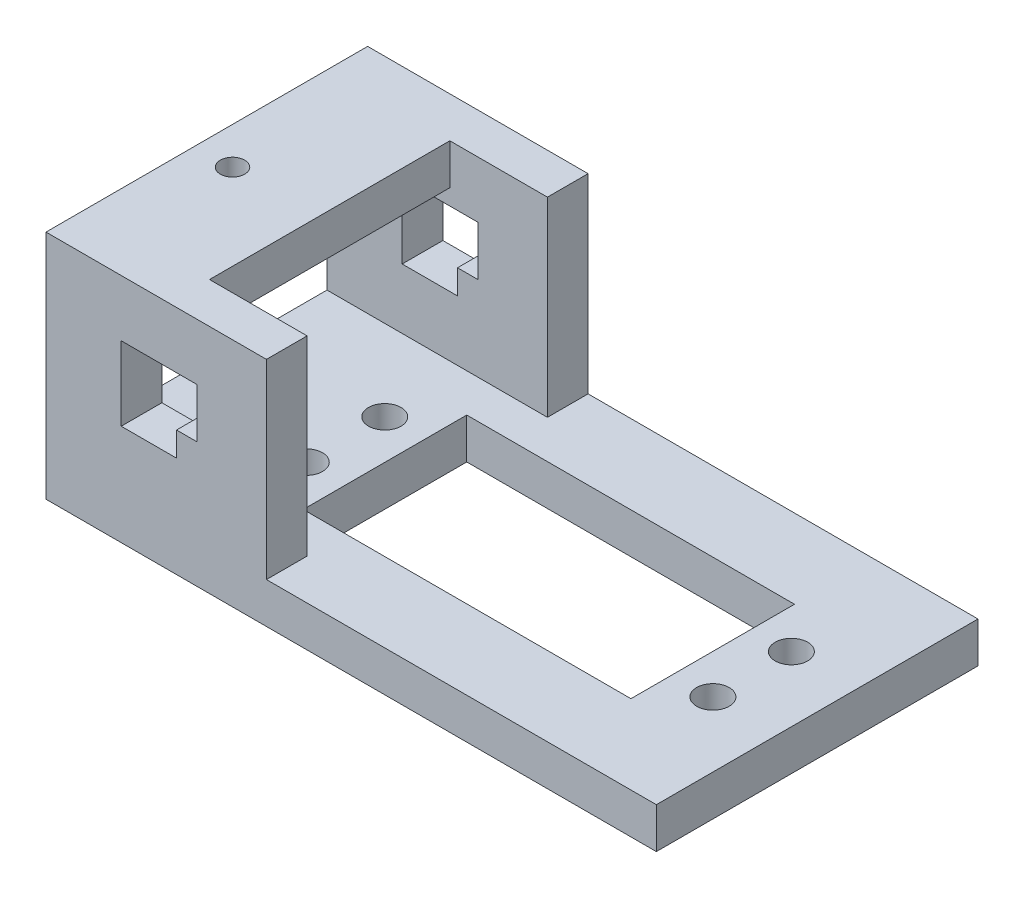
ISO-10303-21;
HEADER;
FILE_DESCRIPTION(('STEP AP214'),'2;1');
FILE_NAME('part.step','',(''),(''),'','','');
FILE_SCHEMA(('AUTOMOTIVE_DESIGN { 1 0 10303 214 1 1 1 1 }'));
ENDSEC;
DATA;
#1=APPLICATION_CONTEXT('core data for automotive mechanical design processes');
#2=APPLICATION_PROTOCOL_DEFINITION('international standard','automotive_design',2000,#1);
#3=PRODUCT_CONTEXT('',#1,'mechanical');
#4=PRODUCT('Part','Part','',(#3));
#5=PRODUCT_RELATED_PRODUCT_CATEGORY('part','',(#4));
#6=PRODUCT_DEFINITION_FORMATION('','',#4);
#7=PRODUCT_DEFINITION_CONTEXT('part definition',#1,'design');
#8=PRODUCT_DEFINITION('design','',#6,#7);
#9=PRODUCT_DEFINITION_SHAPE('','',#8);
#10=(LENGTH_UNIT() NAMED_UNIT(*) SI_UNIT(.MILLI.,.METRE.));
#11=(NAMED_UNIT(*) PLANE_ANGLE_UNIT() SI_UNIT($,.RADIAN.));
#12=(NAMED_UNIT(*) SI_UNIT($,.STERADIAN.) SOLID_ANGLE_UNIT());
#13=UNCERTAINTY_MEASURE_WITH_UNIT(LENGTH_MEASURE(1.E-05),#10,'distance_accuracy_value','');
#14=(GEOMETRIC_REPRESENTATION_CONTEXT(3) GLOBAL_UNCERTAINTY_ASSIGNED_CONTEXT((#13)) GLOBAL_UNIT_ASSIGNED_CONTEXT((#10,
#11,#12)) REPRESENTATION_CONTEXT('',''));
#15=CARTESIAN_POINT('',(0.,0.,0.));
#16=DIRECTION('',(0.,0.,1.));
#17=DIRECTION('',(1.,0.,0.));
#18=AXIS2_PLACEMENT_3D('',#15,#16,#17);
#19=CARTESIAN_POINT('',(-12.9434760941308,23.45,19.7750000000001));
#20=DIRECTION('',(-1.,0.,0.));
#21=DIRECTION('',(0.,0.,1.));
#22=AXIS2_PLACEMENT_3D('',#19,#20,#21);
#23=PLANE('',#22);
#24=DIRECTION('',(0.,-1.,0.));
#25=VECTOR('',#24,1.);
#26=CARTESIAN_POINT('',(-12.9434760941308,23.45,14.7750000000001));
#27=LINE('',#26,#25);
#28=CARTESIAN_POINT('',(-12.9434760941308,28.45,14.7750000000001));
#29=VERTEX_POINT('',#28);
#30=CARTESIAN_POINT('',(-12.9434760941308,5.,14.7750000000001));
#31=VERTEX_POINT('',#30);
#32=EDGE_CURVE('E464',#29,#31,#27,.T.);
#33=ORIENTED_EDGE('',*,*,#32,.F.);
#34=DIRECTION('',(0.,0.,1.));
#35=VECTOR('',#34,1.);
#36=CARTESIAN_POINT('',(-12.9434760941308,28.45,-43.4163080647521));
#37=LINE('',#36,#35);
#38=CARTESIAN_POINT('',(-12.9434760941308,28.45,19.7750000000001));
#39=VERTEX_POINT('',#38);
#40=EDGE_CURVE('E438',#29,#39,#37,.T.);
#41=ORIENTED_EDGE('',*,*,#40,.T.);
#42=DIRECTION('',(0.,-1.,0.));
#43=VECTOR('',#42,1.);
#44=CARTESIAN_POINT('',(-12.9434760941308,23.45,19.7750000000001));
#45=LINE('',#44,#43);
#46=CARTESIAN_POINT('',(-12.9434760941308,5.,19.7750000000001));
#47=VERTEX_POINT('',#46);
#48=EDGE_CURVE('E474',#39,#47,#45,.T.);
#49=ORIENTED_EDGE('',*,*,#48,.T.);
#50=DIRECTION('',(0.,0.,-1.));
#51=VECTOR('',#50,1.);
#52=CARTESIAN_POINT('',(-12.9434760941308,5.,19.7750000000001));
#53=LINE('',#52,#51);
#54=EDGE_CURVE('E460',#47,#31,#53,.T.);
#55=ORIENTED_EDGE('',*,*,#54,.T.);
#56=EDGE_LOOP('',(#33,#41,#49,#55));
#57=FACE_BOUND('',#56,.T.);
#58=ADVANCED_FACE('F38',(#57),#23,.F.);
#59=CARTESIAN_POINT('',(-12.9434760941308,28.45,-19.7750000000002));
#60=VERTEX_POINT('',#59);
#61=CARTESIAN_POINT('',(-12.9434760941308,28.45,-14.7750000000002));
#62=VERTEX_POINT('',#61);
#63=EDGE_CURVE('E435',#60,#62,#37,.T.);
#64=ORIENTED_EDGE('',*,*,#63,.T.);
#65=DIRECTION('',(0.,-1.,0.));
#66=VECTOR('',#65,1.);
#67=CARTESIAN_POINT('',(-12.9434760941308,23.45,-14.7750000000002));
#68=LINE('',#67,#66);
#69=CARTESIAN_POINT('',(-12.9434760941308,5.,-14.7750000000002));
#70=VERTEX_POINT('',#69);
#71=EDGE_CURVE('E446',#62,#70,#68,.T.);
#72=ORIENTED_EDGE('',*,*,#71,.T.);
#73=DIRECTION('',(0.,0.,-1.));
#74=VECTOR('',#73,1.);
#75=CARTESIAN_POINT('',(-12.9434760941308,5.,-14.7750000000002));
#76=LINE('',#75,#74);
#77=CARTESIAN_POINT('',(-12.9434760941308,5.,-19.7750000000002));
#78=VERTEX_POINT('',#77);
#79=EDGE_CURVE('E434',#70,#78,#76,.T.);
#80=ORIENTED_EDGE('',*,*,#79,.T.);
#81=DIRECTION('',(0.,-1.,0.));
#82=VECTOR('',#81,1.);
#83=CARTESIAN_POINT('',(-12.9434760941308,23.45,-19.7750000000002));
#84=LINE('',#83,#82);
#85=EDGE_CURVE('E456',#60,#78,#84,.T.);
#86=ORIENTED_EDGE('',*,*,#85,.F.);
#87=EDGE_LOOP('',(#64,#72,#80,#86));
#88=FACE_BOUND('',#87,.T.);
#89=ADVANCED_FACE('F582',(#88),#23,.F.);
#90=CARTESIAN_POINT('',(-36.05,23.45,-43.4163080647521));
#91=DIRECTION('',(0.,-1.,0.));
#92=DIRECTION('',(0.,0.,-1.));
#93=AXIS2_PLACEMENT_3D('',#90,#91,#92);
#94=PLANE('',#93);
#95=CARTESIAN_POINT('',(-35.49673805,23.45,1.39499999999984));
#96=DIRECTION('',(0.,-1.,0.));
#97=DIRECTION('',(0.,0.,-1.));
#98=AXIS2_PLACEMENT_3D('',#95,#96,#97);
#99=CIRCLE('',#98,1.5);
#100=CARTESIAN_POINT('',(-35.49673805,23.45,-0.105000000000165));
#101=VERTEX_POINT('',#100);
#102=EDGE_CURVE('E241',#101,#101,#99,.F.);
#103=ORIENTED_EDGE('',*,*,#102,.T.);
#104=EDGE_LOOP('',(#103));
#105=FACE_BOUND('',#104,.T.);
#106=DIRECTION('',(1.,0.,0.));
#107=VECTOR('',#106,1.);
#108=CARTESIAN_POINT('',(-12.9434760941308,23.45,-14.7750000000002));
#109=LINE('',#108,#107);
#110=CARTESIAN_POINT('',(-40.05,23.45,-14.7750000000002));
#111=VERTEX_POINT('',#110);
#112=CARTESIAN_POINT('',(-24.9434760941308,23.45,-14.7750000000002));
#113=VERTEX_POINT('',#112);
#114=EDGE_CURVE('E442',#111,#113,#109,.T.);
#115=ORIENTED_EDGE('',*,*,#114,.T.);
#116=DIRECTION('',(0.,0.,1.));
#117=VECTOR('',#116,1.);
#118=CARTESIAN_POINT('',(-24.9434760941308,23.45,-43.4163080647521));
#119=LINE('',#118,#117);
#120=CARTESIAN_POINT('',(-24.9434760941308,23.45,14.7750000000001));
#121=VERTEX_POINT('',#120);
#122=EDGE_CURVE('E411',#113,#121,#119,.T.);
#123=ORIENTED_EDGE('',*,*,#122,.T.);
#124=DIRECTION('',(-1.,0.,0.));
#125=VECTOR('',#124,1.);
#126=CARTESIAN_POINT('',(-36.05,23.45,14.7750000000001));
#127=LINE('',#126,#125);
#128=CARTESIAN_POINT('',(-40.05,23.45,14.7750000000001));
#129=VERTEX_POINT('',#128);
#130=EDGE_CURVE('E461',#121,#129,#127,.T.);
#131=ORIENTED_EDGE('',*,*,#130,.T.);
#132=DIRECTION('',(0.,0.,-1.));
#133=VECTOR('',#132,1.);
#134=CARTESIAN_POINT('',(-40.05,23.45,-14.7750000000002));
#135=LINE('',#134,#133);
#136=EDGE_CURVE('E279',#129,#111,#135,.T.);
#137=ORIENTED_EDGE('',*,*,#136,.T.);
#138=EDGE_LOOP('',(#115,#123,#131,#137));
#139=FACE_BOUND('',#138,.T.);
#140=ADVANCED_FACE('F588',(#105,#139),#94,.T.);
#141=CARTESIAN_POINT('',(-36.05,28.45,-43.4163080647521));
#142=DIRECTION('',(0.,1.,0.));
#143=DIRECTION('',(0.,0.,1.));
#144=AXIS2_PLACEMENT_3D('',#141,#142,#143);
#145=PLANE('',#144);
#146=CARTESIAN_POINT('',(-35.49673805,28.45,1.39499999999984));
#147=DIRECTION('',(0.,1.,0.));
#148=DIRECTION('',(0.,0.,1.));
#149=AXIS2_PLACEMENT_3D('',#146,#147,#148);
#150=CIRCLE('',#149,1.5);
#151=CARTESIAN_POINT('',(-35.49673805,28.45,2.89499999999984));
#152=VERTEX_POINT('',#151);
#153=EDGE_CURVE('E669',#152,#152,#150,.T.);
#154=ORIENTED_EDGE('',*,*,#153,.F.);
#155=EDGE_LOOP('',(#154));
#156=FACE_BOUND('',#155,.T.);
#157=ORIENTED_EDGE('',*,*,#40,.F.);
#158=DIRECTION('',(1.,0.,0.));
#159=VECTOR('',#158,1.);
#160=CARTESIAN_POINT('',(-24.9434760941308,28.45,14.7750000000001));
#161=LINE('',#160,#159);
#162=CARTESIAN_POINT('',(-24.9434760941308,28.45,14.7750000000001));
#163=VERTEX_POINT('',#162);
#164=EDGE_CURVE('E407',#163,#29,#161,.T.);
#165=ORIENTED_EDGE('',*,*,#164,.F.);
#166=DIRECTION('',(0.,0.,1.));
#167=VECTOR('',#166,1.);
#168=CARTESIAN_POINT('',(-24.9434760941308,28.45,14.7750000000001));
#169=LINE('',#168,#167);
#170=CARTESIAN_POINT('',(-24.9434760941308,28.45,-14.7750000000002));
#171=VERTEX_POINT('',#170);
#172=EDGE_CURVE('E412',#171,#163,#169,.T.);
#173=ORIENTED_EDGE('',*,*,#172,.F.);
#174=DIRECTION('',(-1.,0.,0.));
#175=VECTOR('',#174,1.);
#176=CARTESIAN_POINT('',(-24.9434760941308,28.45,-14.7750000000002));
#177=LINE('',#176,#175);
#178=EDGE_CURVE('E416',#62,#171,#177,.T.);
#179=ORIENTED_EDGE('',*,*,#178,.F.);
#180=ORIENTED_EDGE('',*,*,#63,.F.);
#181=DIRECTION('',(1.,0.,0.));
#182=VECTOR('',#181,1.);
#183=CARTESIAN_POINT('',(-36.05,28.45,-19.7750000000002));
#184=LINE('',#183,#182);
#185=CARTESIAN_POINT('',(-40.05,28.45,-19.7750000000002));
#186=VERTEX_POINT('',#185);
#187=EDGE_CURVE('E430',#186,#60,#184,.T.);
#188=ORIENTED_EDGE('',*,*,#187,.F.);
#189=DIRECTION('',(0.,0.,-1.));
#190=VECTOR('',#189,1.);
#191=CARTESIAN_POINT('',(-40.05,28.45,19.7750000000001));
#192=LINE('',#191,#190);
#193=CARTESIAN_POINT('',(-40.05,28.45,19.7750000000001));
#194=VERTEX_POINT('',#193);
#195=EDGE_CURVE('E303',#194,#186,#192,.T.);
#196=ORIENTED_EDGE('',*,*,#195,.F.);
#197=DIRECTION('',(-1.,0.,0.));
#198=VECTOR('',#197,1.);
#199=CARTESIAN_POINT('',(-36.05,28.45,19.7750000000001));
#200=LINE('',#199,#198);
#201=EDGE_CURVE('E429',#39,#194,#200,.T.);
#202=ORIENTED_EDGE('',*,*,#201,.F.);
#203=EDGE_LOOP('',(#157,#165,#173,#179,#180,#188,#196,#202));
#204=FACE_BOUND('',#203,.T.);
#205=ADVANCED_FACE('F614',(#156,#204),#145,.T.);
#206=CARTESIAN_POINT('',(0.,5.,0.));
#207=DIRECTION('',(0.,1.,0.));
#208=DIRECTION('',(0.,0.,1.));
#209=AXIS2_PLACEMENT_3D('',#206,#207,#208);
#210=PLANE('',#209);
#211=DIRECTION('',(-1.,0.,0.));
#212=VECTOR('',#211,1.);
#213=CARTESIAN_POINT('',(22.15,5.,-10.06));
#214=LINE('',#213,#212);
#215=CARTESIAN_POINT('',(22.15,5.,-10.06));
#216=VERTEX_POINT('',#215);
#217=CARTESIAN_POINT('',(-18.15,5.,-10.06));
#218=VERTEX_POINT('',#217);
#219=EDGE_CURVE('E227',#216,#218,#214,.T.);
#220=ORIENTED_EDGE('',*,*,#219,.F.);
#221=DIRECTION('',(0.,0.,-1.));
#222=VECTOR('',#221,1.);
#223=CARTESIAN_POINT('',(22.15,5.,10.05));
#224=LINE('',#223,#222);
#225=CARTESIAN_POINT('',(22.15,5.,10.05));
#226=VERTEX_POINT('',#225);
#227=EDGE_CURVE('E236',#226,#216,#224,.T.);
#228=ORIENTED_EDGE('',*,*,#227,.F.);
#229=DIRECTION('',(1.,0.,0.));
#230=VECTOR('',#229,1.);
#231=CARTESIAN_POINT('',(-18.15,5.,10.05));
#232=LINE('',#231,#230);
#233=CARTESIAN_POINT('',(-18.15,5.,10.05));
#234=VERTEX_POINT('',#233);
#235=EDGE_CURVE('E54',#234,#226,#232,.T.);
#236=ORIENTED_EDGE('',*,*,#235,.F.);
#237=DIRECTION('',(0.,0.,1.));
#238=VECTOR('',#237,1.);
#239=CARTESIAN_POINT('',(-18.15,5.,-10.06));
#240=LINE('',#239,#238);
#241=EDGE_CURVE('E246',#218,#234,#240,.T.);
#242=ORIENTED_EDGE('',*,*,#241,.F.);
#243=EDGE_LOOP('',(#220,#228,#236,#242));
#244=FACE_BOUND('',#243,.T.);
#245=CARTESIAN_POINT('',(-23.,5.,4.82));
#246=DIRECTION('',(0.,1.,0.));
#247=DIRECTION('',(0.,0.,1.));
#248=AXIS2_PLACEMENT_3D('',#245,#246,#247);
#249=CIRCLE('',#248,2.);
#250=CARTESIAN_POINT('',(-23.,5.,6.82));
#251=VERTEX_POINT('',#250);
#252=EDGE_CURVE('E503',#251,#251,#249,.T.);
#253=ORIENTED_EDGE('',*,*,#252,.F.);
#254=EDGE_LOOP('',(#253));
#255=FACE_BOUND('',#254,.T.);
#256=CARTESIAN_POINT('',(-23.,5.,-4.83));
#257=DIRECTION('',(0.,1.,0.));
#258=DIRECTION('',(0.,0.,1.));
#259=AXIS2_PLACEMENT_3D('',#256,#257,#258);
#260=CIRCLE('',#259,2.);
#261=CARTESIAN_POINT('',(-23.,5.,-2.83));
#262=VERTEX_POINT('',#261);
#263=EDGE_CURVE('E495',#262,#262,#260,.T.);
#264=ORIENTED_EDGE('',*,*,#263,.F.);
#265=EDGE_LOOP('',(#264));
#266=FACE_BOUND('',#265,.T.);
#267=DIRECTION('',(1.,0.,0.));
#268=VECTOR('',#267,1.);
#269=CARTESIAN_POINT('',(-12.9434760941308,5.,-14.7750000000002));
#270=LINE('',#269,#268);
#271=CARTESIAN_POINT('',(-40.05,5.,-14.7750000000002));
#272=VERTEX_POINT('',#271);
#273=EDGE_CURVE('E447',#272,#70,#270,.T.);
#274=ORIENTED_EDGE('',*,*,#273,.F.);
#275=DIRECTION('',(0.,0.,1.));
#276=VECTOR('',#275,1.);
#277=CARTESIAN_POINT('',(-40.05,5.,-14.7750000000002));
#278=LINE('',#277,#276);
#279=CARTESIAN_POINT('',(-40.05,5.,14.7750000000001));
#280=VERTEX_POINT('',#279);
#281=EDGE_CURVE('E287',#272,#280,#278,.T.);
#282=ORIENTED_EDGE('',*,*,#281,.T.);
#283=DIRECTION('',(-1.,0.,0.));
#284=VECTOR('',#283,1.);
#285=CARTESIAN_POINT('',(-36.05,5.,14.7750000000001));
#286=LINE('',#285,#284);
#287=EDGE_CURVE('E465',#31,#280,#286,.T.);
#288=ORIENTED_EDGE('',*,*,#287,.F.);
#289=ORIENTED_EDGE('',*,*,#54,.F.);
#290=DIRECTION('',(1.,0.,0.));
#291=VECTOR('',#290,1.);
#292=CARTESIAN_POINT('',(-27.,5.,19.7750000000001));
#293=LINE('',#292,#291);
#294=CARTESIAN_POINT('',(35.,5.,19.7750000000001));
#295=VERTEX_POINT('',#294);
#296=EDGE_CURVE('E514',#47,#295,#293,.T.);
#297=ORIENTED_EDGE('',*,*,#296,.T.);
#298=DIRECTION('',(0.,0.,1.));
#299=VECTOR('',#298,1.);
#300=CARTESIAN_POINT('',(35.,5.,-19.7750000000002));
#301=LINE('',#300,#299);
#302=CARTESIAN_POINT('',(35.,5.,-19.7750000000002));
#303=VERTEX_POINT('',#302);
#304=EDGE_CURVE('E275',#303,#295,#301,.T.);
#305=ORIENTED_EDGE('',*,*,#304,.F.);
#306=DIRECTION('',(-1.,0.,0.));
#307=VECTOR('',#306,1.);
#308=CARTESIAN_POINT('',(31.,5.,-19.7750000000002));
#309=LINE('',#308,#307);
#310=EDGE_CURVE('E511',#303,#78,#309,.T.);
#311=ORIENTED_EDGE('',*,*,#310,.T.);
#312=ORIENTED_EDGE('',*,*,#79,.F.);
#313=EDGE_LOOP('',(#274,#282,#288,#289,#297,#305,#311,#312));
#314=FACE_BOUND('',#313,.T.);
#315=CARTESIAN_POINT('',(27.,5.,-4.83));
#316=DIRECTION('',(0.,1.,0.));
#317=DIRECTION('',(0.,0.,-1.));
#318=AXIS2_PLACEMENT_3D('',#315,#316,#317);
#319=CIRCLE('',#318,2.);
#320=CARTESIAN_POINT('',(27.,5.,-6.83));
#321=VERTEX_POINT('',#320);
#322=EDGE_CURVE('E479',#321,#321,#319,.T.);
#323=ORIENTED_EDGE('',*,*,#322,.F.);
#324=EDGE_LOOP('',(#323));
#325=FACE_BOUND('',#324,.T.);
#326=CARTESIAN_POINT('',(27.,5.,4.82));
#327=DIRECTION('',(0.,1.,0.));
#328=DIRECTION('',(0.,0.,-1.));
#329=AXIS2_PLACEMENT_3D('',#326,#327,#328);
#330=CIRCLE('',#329,2.);
#331=CARTESIAN_POINT('',(27.,5.,2.82));
#332=VERTEX_POINT('',#331);
#333=EDGE_CURVE('E487',#332,#332,#330,.T.);
#334=ORIENTED_EDGE('',*,*,#333,.F.);
#335=EDGE_LOOP('',(#334));
#336=FACE_BOUND('',#335,.T.);
#337=ADVANCED_FACE('F243',(#244,#255,#266,#314,#325,#336),#210,.T.);
#338=CARTESIAN_POINT('',(0.,0.,0.));
#339=DIRECTION('',(0.,1.,0.));
#340=DIRECTION('',(0.,0.,1.));
#341=AXIS2_PLACEMENT_3D('',#338,#339,#340);
#342=PLANE('',#341);
#343=DIRECTION('',(0.,0.,1.));
#344=VECTOR('',#343,1.);
#345=CARTESIAN_POINT('',(22.15,0.,10.05));
#346=LINE('',#345,#344);
#347=CARTESIAN_POINT('',(22.15,0.,-10.06));
#348=VERTEX_POINT('',#347);
#349=CARTESIAN_POINT('',(22.15,0.,10.05));
#350=VERTEX_POINT('',#349);
#351=EDGE_CURVE('E655',#348,#350,#346,.T.);
#352=ORIENTED_EDGE('',*,*,#351,.F.);
#353=DIRECTION('',(1.,0.,0.));
#354=VECTOR('',#353,1.);
#355=CARTESIAN_POINT('',(22.15,0.,-10.06));
#356=LINE('',#355,#354);
#357=CARTESIAN_POINT('',(-18.15,0.,-10.06));
#358=VERTEX_POINT('',#357);
#359=EDGE_CURVE('E230',#358,#348,#356,.T.);
#360=ORIENTED_EDGE('',*,*,#359,.F.);
#361=DIRECTION('',(0.,0.,-1.));
#362=VECTOR('',#361,1.);
#363=CARTESIAN_POINT('',(-18.15,0.,-10.06));
#364=LINE('',#363,#362);
#365=CARTESIAN_POINT('',(-18.15,0.,10.05));
#366=VERTEX_POINT('',#365);
#367=EDGE_CURVE('E257',#366,#358,#364,.T.);
#368=ORIENTED_EDGE('',*,*,#367,.F.);
#369=DIRECTION('',(-1.,0.,0.));
#370=VECTOR('',#369,1.);
#371=CARTESIAN_POINT('',(-18.15,0.,10.05));
#372=LINE('',#371,#370);
#373=EDGE_CURVE('E658',#350,#366,#372,.T.);
#374=ORIENTED_EDGE('',*,*,#373,.F.);
#375=EDGE_LOOP('',(#352,#360,#368,#374));
#376=FACE_BOUND('',#375,.T.);
#377=DIRECTION('',(-1.,0.,0.));
#378=VECTOR('',#377,1.);
#379=CARTESIAN_POINT('',(-27.,0.,-19.7750000000002));
#380=LINE('',#379,#378);
#381=CARTESIAN_POINT('',(35.,0.,-19.7750000000002));
#382=VERTEX_POINT('',#381);
#383=CARTESIAN_POINT('',(-40.05,0.,-19.7750000000002));
#384=VERTEX_POINT('',#383);
#385=EDGE_CURVE('E507',#382,#384,#380,.T.);
#386=ORIENTED_EDGE('',*,*,#385,.F.);
#387=DIRECTION('',(0.,0.,-1.));
#388=VECTOR('',#387,1.);
#389=CARTESIAN_POINT('',(35.,0.,19.7750000000001));
#390=LINE('',#389,#388);
#391=CARTESIAN_POINT('',(35.,0.,19.7750000000001));
#392=VERTEX_POINT('',#391);
#393=EDGE_CURVE('E267',#392,#382,#390,.T.);
#394=ORIENTED_EDGE('',*,*,#393,.F.);
#395=DIRECTION('',(1.,0.,0.));
#396=VECTOR('',#395,1.);
#397=CARTESIAN_POINT('',(31.,0.,19.7750000000001));
#398=LINE('',#397,#396);
#399=CARTESIAN_POINT('',(-40.05,0.,19.7750000000001));
#400=VERTEX_POINT('',#399);
#401=EDGE_CURVE('E515',#400,#392,#398,.T.);
#402=ORIENTED_EDGE('',*,*,#401,.F.);
#403=DIRECTION('',(0.,0.,1.));
#404=VECTOR('',#403,1.);
#405=CARTESIAN_POINT('',(-40.05,0.,-19.7750000000002));
#406=LINE('',#405,#404);
#407=EDGE_CURVE('E295',#384,#400,#406,.T.);
#408=ORIENTED_EDGE('',*,*,#407,.F.);
#409=EDGE_LOOP('',(#386,#394,#402,#408));
#410=FACE_BOUND('',#409,.T.);
#411=CARTESIAN_POINT('',(-23.,0.,4.82));
#412=DIRECTION('',(0.,1.,0.));
#413=DIRECTION('',(0.,0.,1.));
#414=AXIS2_PLACEMENT_3D('',#411,#412,#413);
#415=CIRCLE('',#414,2.);
#416=CARTESIAN_POINT('',(-23.,0.,6.82));
#417=VERTEX_POINT('',#416);
#418=EDGE_CURVE('E499',#417,#417,#415,.T.);
#419=ORIENTED_EDGE('',*,*,#418,.T.);
#420=EDGE_LOOP('',(#419));
#421=FACE_BOUND('',#420,.T.);
#422=CARTESIAN_POINT('',(-23.,0.,-4.83));
#423=DIRECTION('',(0.,1.,0.));
#424=DIRECTION('',(0.,0.,1.));
#425=AXIS2_PLACEMENT_3D('',#422,#423,#424);
#426=CIRCLE('',#425,2.);
#427=CARTESIAN_POINT('',(-23.,0.,-2.83));
#428=VERTEX_POINT('',#427);
#429=EDGE_CURVE('E491',#428,#428,#426,.T.);
#430=ORIENTED_EDGE('',*,*,#429,.T.);
#431=EDGE_LOOP('',(#430));
#432=FACE_BOUND('',#431,.T.);
#433=CARTESIAN_POINT('',(27.,0.,4.82));
#434=DIRECTION('',(0.,1.,0.));
#435=DIRECTION('',(0.,0.,-1.));
#436=AXIS2_PLACEMENT_3D('',#433,#434,#435);
#437=CIRCLE('',#436,2.);
#438=CARTESIAN_POINT('',(27.,0.,2.82));
#439=VERTEX_POINT('',#438);
#440=EDGE_CURVE('E483',#439,#439,#437,.T.);
#441=ORIENTED_EDGE('',*,*,#440,.T.);
#442=EDGE_LOOP('',(#441));
#443=FACE_BOUND('',#442,.T.);
#444=CARTESIAN_POINT('',(27.,0.,-4.83));
#445=DIRECTION('',(0.,1.,0.));
#446=DIRECTION('',(0.,0.,-1.));
#447=AXIS2_PLACEMENT_3D('',#444,#445,#446);
#448=CIRCLE('',#447,2.);
#449=CARTESIAN_POINT('',(27.,0.,-6.83));
#450=VERTEX_POINT('',#449);
#451=EDGE_CURVE('E478',#450,#450,#448,.T.);
#452=ORIENTED_EDGE('',*,*,#451,.T.);
#453=EDGE_LOOP('',(#452));
#454=FACE_BOUND('',#453,.T.);
#455=ADVANCED_FACE('F613',(#376,#410,#421,#432,#443,#454),#342,.F.);
#456=CARTESIAN_POINT('',(-27.,5.,-19.7750000000002));
#457=DIRECTION('',(0.,0.,1.));
#458=DIRECTION('',(1.,0.,0.));
#459=AXIS2_PLACEMENT_3D('',#456,#457,#458);
#460=PLANE('',#459);
#461=DIRECTION('',(0.,-1.,0.));
#462=VECTOR('',#461,1.);
#463=CARTESIAN_POINT('',(-21.5,15.4,-19.7750000000002));
#464=LINE('',#463,#462);
#465=CARTESIAN_POINT('',(-21.5,21.5,-19.7750000000002));
#466=VERTEX_POINT('',#465);
#467=CARTESIAN_POINT('',(-21.5,15.4,-19.7750000000002));
#468=VERTEX_POINT('',#467);
#469=EDGE_CURVE('E317',#466,#468,#464,.T.);
#470=ORIENTED_EDGE('',*,*,#469,.F.);
#471=DIRECTION('',(1.,0.,0.));
#472=VECTOR('',#471,1.);
#473=CARTESIAN_POINT('',(-24.05,21.5,-19.7750000000002));
#474=LINE('',#473,#472);
#475=CARTESIAN_POINT('',(-30.8,21.5,-19.7750000000002));
#476=VERTEX_POINT('',#475);
#477=EDGE_CURVE('E312',#476,#466,#474,.T.);
#478=ORIENTED_EDGE('',*,*,#477,.F.);
#479=DIRECTION('',(0.,1.,0.));
#480=VECTOR('',#479,1.);
#481=CARTESIAN_POINT('',(-30.8,15.45,-19.7750000000002));
#482=LINE('',#481,#480);
#483=CARTESIAN_POINT('',(-30.8,12.4,-19.7750000000002));
#484=VERTEX_POINT('',#483);
#485=EDGE_CURVE('E318',#484,#476,#482,.T.);
#486=ORIENTED_EDGE('',*,*,#485,.F.);
#487=DIRECTION('',(-1.,0.,0.));
#488=VECTOR('',#487,1.);
#489=CARTESIAN_POINT('',(-30.8,12.4,-19.7750000000002));
#490=LINE('',#489,#488);
#491=CARTESIAN_POINT('',(-24.,12.4,-19.7750000000002));
#492=VERTEX_POINT('',#491);
#493=EDGE_CURVE('E321',#492,#484,#490,.T.);
#494=ORIENTED_EDGE('',*,*,#493,.F.);
#495=DIRECTION('',(0.,-1.,0.));
#496=VECTOR('',#495,1.);
#497=CARTESIAN_POINT('',(-24.,12.4,-19.7750000000002));
#498=LINE('',#497,#496);
#499=CARTESIAN_POINT('',(-24.,15.4,-19.7750000000002));
#500=VERTEX_POINT('',#499);
#501=EDGE_CURVE('E325',#500,#492,#498,.T.);
#502=ORIENTED_EDGE('',*,*,#501,.F.);
#503=DIRECTION('',(-1.,0.,0.));
#504=VECTOR('',#503,1.);
#505=CARTESIAN_POINT('',(-24.,15.4,-19.7750000000002));
#506=LINE('',#505,#504);
#507=EDGE_CURVE('E328',#468,#500,#506,.T.);
#508=ORIENTED_EDGE('',*,*,#507,.F.);
#509=EDGE_LOOP('',(#470,#478,#486,#494,#502,#508));
#510=FACE_BOUND('',#509,.T.);
#511=ORIENTED_EDGE('',*,*,#385,.T.);
#512=DIRECTION('',(0.,-1.,0.));
#513=VECTOR('',#512,1.);
#514=CARTESIAN_POINT('',(-40.05,28.45,-19.7750000000002));
#515=LINE('',#514,#513);
#516=EDGE_CURVE('E307',#186,#384,#515,.T.);
#517=ORIENTED_EDGE('',*,*,#516,.F.);
#518=ORIENTED_EDGE('',*,*,#187,.T.);
#519=ORIENTED_EDGE('',*,*,#85,.T.);
#520=ORIENTED_EDGE('',*,*,#310,.F.);
#521=DIRECTION('',(0.,1.,0.));
#522=VECTOR('',#521,1.);
#523=CARTESIAN_POINT('',(35.,0.,-19.7750000000002));
#524=LINE('',#523,#522);
#525=EDGE_CURVE('E271',#382,#303,#524,.T.);
#526=ORIENTED_EDGE('',*,*,#525,.F.);
#527=EDGE_LOOP('',(#511,#517,#518,#519,#520,#526));
#528=FACE_BOUND('',#527,.T.);
#529=ADVANCED_FACE('F40',(#510,#528),#460,.F.);
#530=CARTESIAN_POINT('',(31.,5.,19.7750000000001));
#531=DIRECTION('',(0.,0.,-1.));
#532=DIRECTION('',(-1.,0.,0.));
#533=AXIS2_PLACEMENT_3D('',#530,#531,#532);
#534=PLANE('',#533);
#535=DIRECTION('',(0.,-1.,0.));
#536=VECTOR('',#535,1.);
#537=CARTESIAN_POINT('',(-30.8,15.45,19.7750000000001));
#538=LINE('',#537,#536);
#539=CARTESIAN_POINT('',(-30.8,21.5,19.7750000000001));
#540=VERTEX_POINT('',#539);
#541=CARTESIAN_POINT('',(-30.8,12.4,19.7750000000001));
#542=VERTEX_POINT('',#541);
#543=EDGE_CURVE('E336',#540,#542,#538,.T.);
#544=ORIENTED_EDGE('',*,*,#543,.F.);
#545=DIRECTION('',(-1.,0.,0.));
#546=VECTOR('',#545,1.);
#547=CARTESIAN_POINT('',(-24.05,21.5,19.7750000000001));
#548=LINE('',#547,#546);
#549=CARTESIAN_POINT('',(-21.5,21.5,19.7750000000001));
#550=VERTEX_POINT('',#549);
#551=EDGE_CURVE('E311',#550,#540,#548,.T.);
#552=ORIENTED_EDGE('',*,*,#551,.F.);
#553=DIRECTION('',(0.,1.,0.));
#554=VECTOR('',#553,1.);
#555=CARTESIAN_POINT('',(-21.5,15.4,19.7750000000001));
#556=LINE('',#555,#554);
#557=CARTESIAN_POINT('',(-21.5,15.4,19.7750000000001));
#558=VERTEX_POINT('',#557);
#559=EDGE_CURVE('E351',#558,#550,#556,.T.);
#560=ORIENTED_EDGE('',*,*,#559,.F.);
#561=DIRECTION('',(1.,0.,0.));
#562=VECTOR('',#561,1.);
#563=CARTESIAN_POINT('',(-24.,15.4,19.7750000000001));
#564=LINE('',#563,#562);
#565=CARTESIAN_POINT('',(-24.,15.4,19.7750000000001));
#566=VERTEX_POINT('',#565);
#567=EDGE_CURVE('E348',#566,#558,#564,.T.);
#568=ORIENTED_EDGE('',*,*,#567,.F.);
#569=DIRECTION('',(0.,1.,0.));
#570=VECTOR('',#569,1.);
#571=CARTESIAN_POINT('',(-24.,12.4,19.7750000000001));
#572=LINE('',#571,#570);
#573=CARTESIAN_POINT('',(-24.,12.4,19.7750000000001));
#574=VERTEX_POINT('',#573);
#575=EDGE_CURVE('E344',#574,#566,#572,.T.);
#576=ORIENTED_EDGE('',*,*,#575,.F.);
#577=DIRECTION('',(1.,0.,0.));
#578=VECTOR('',#577,1.);
#579=CARTESIAN_POINT('',(-30.8,12.4,19.7750000000001));
#580=LINE('',#579,#578);
#581=EDGE_CURVE('E340',#542,#574,#580,.T.);
#582=ORIENTED_EDGE('',*,*,#581,.F.);
#583=EDGE_LOOP('',(#544,#552,#560,#568,#576,#582));
#584=FACE_BOUND('',#583,.T.);
#585=ORIENTED_EDGE('',*,*,#401,.T.);
#586=DIRECTION('',(0.,-1.,0.));
#587=VECTOR('',#586,1.);
#588=CARTESIAN_POINT('',(35.,5.,19.7750000000001));
#589=LINE('',#588,#587);
#590=EDGE_CURVE('E263',#295,#392,#589,.T.);
#591=ORIENTED_EDGE('',*,*,#590,.F.);
#592=ORIENTED_EDGE('',*,*,#296,.F.);
#593=ORIENTED_EDGE('',*,*,#48,.F.);
#594=ORIENTED_EDGE('',*,*,#201,.T.);
#595=DIRECTION('',(0.,1.,0.));
#596=VECTOR('',#595,1.);
#597=CARTESIAN_POINT('',(-40.05,0.,19.7750000000001));
#598=LINE('',#597,#596);
#599=EDGE_CURVE('E299',#400,#194,#598,.T.);
#600=ORIENTED_EDGE('',*,*,#599,.F.);
#601=EDGE_LOOP('',(#585,#591,#592,#593,#594,#600));
#602=FACE_BOUND('',#601,.T.);
#603=ADVANCED_FACE('F609',(#584,#602),#534,.F.);
#604=CARTESIAN_POINT('',(-23.,5.,4.82));
#605=DIRECTION('',(0.,-1.,0.));
#606=DIRECTION('',(0.,0.,-1.));
#607=AXIS2_PLACEMENT_3D('',#604,#605,#606);
#608=CYLINDRICAL_SURFACE('',#607,2.);
#609=ORIENTED_EDGE('',*,*,#252,.T.);
#610=EDGE_LOOP('',(#609));
#611=FACE_BOUND('',#610,.T.);
#612=ORIENTED_EDGE('',*,*,#418,.F.);
#613=EDGE_LOOP('',(#612));
#614=FACE_BOUND('',#613,.T.);
#615=ADVANCED_FACE('F605',(#611,#614),#608,.F.);
#616=CARTESIAN_POINT('',(-23.,5.,-4.83));
#617=DIRECTION('',(0.,-1.,0.));
#618=DIRECTION('',(0.,0.,-1.));
#619=AXIS2_PLACEMENT_3D('',#616,#617,#618);
#620=CYLINDRICAL_SURFACE('',#619,2.);
#621=ORIENTED_EDGE('',*,*,#263,.T.);
#622=EDGE_LOOP('',(#621));
#623=FACE_BOUND('',#622,.T.);
#624=ORIENTED_EDGE('',*,*,#429,.F.);
#625=EDGE_LOOP('',(#624));
#626=FACE_BOUND('',#625,.T.);
#627=ADVANCED_FACE('F601',(#623,#626),#620,.F.);
#628=CARTESIAN_POINT('',(27.,5.,4.82));
#629=DIRECTION('',(0.,-1.,0.));
#630=DIRECTION('',(0.,0.,-1.));
#631=AXIS2_PLACEMENT_3D('',#628,#629,#630);
#632=CYLINDRICAL_SURFACE('',#631,2.);
#633=ORIENTED_EDGE('',*,*,#333,.T.);
#634=EDGE_LOOP('',(#633));
#635=FACE_BOUND('',#634,.T.);
#636=ORIENTED_EDGE('',*,*,#440,.F.);
#637=EDGE_LOOP('',(#636));
#638=FACE_BOUND('',#637,.T.);
#639=ADVANCED_FACE('F597',(#635,#638),#632,.F.);
#640=CARTESIAN_POINT('',(27.,5.,-4.83));
#641=DIRECTION('',(0.,-1.,0.));
#642=DIRECTION('',(0.,0.,-1.));
#643=AXIS2_PLACEMENT_3D('',#640,#641,#642);
#644=CYLINDRICAL_SURFACE('',#643,2.);
#645=ORIENTED_EDGE('',*,*,#322,.T.);
#646=EDGE_LOOP('',(#645));
#647=FACE_BOUND('',#646,.T.);
#648=ORIENTED_EDGE('',*,*,#451,.F.);
#649=EDGE_LOOP('',(#648));
#650=FACE_BOUND('',#649,.T.);
#651=ADVANCED_FACE('F594',(#647,#650),#644,.F.);
#652=CARTESIAN_POINT('',(-36.05,23.45,14.7750000000001));
#653=DIRECTION('',(0.,0.,1.));
#654=DIRECTION('',(1.,0.,0.));
#655=AXIS2_PLACEMENT_3D('',#652,#653,#654);
#656=PLANE('',#655);
#657=DIRECTION('',(0.,1.,0.));
#658=VECTOR('',#657,1.);
#659=CARTESIAN_POINT('',(-21.5,23.45,14.7750000000001));
#660=LINE('',#659,#658);
#661=CARTESIAN_POINT('',(-21.5,15.4,14.7750000000001));
#662=VERTEX_POINT('',#661);
#663=CARTESIAN_POINT('',(-21.5,21.5,14.7750000000001));
#664=VERTEX_POINT('',#663);
#665=EDGE_CURVE('E316',#662,#664,#660,.T.);
#666=ORIENTED_EDGE('',*,*,#665,.T.);
#667=DIRECTION('',(-1.,0.,0.));
#668=VECTOR('',#667,1.);
#669=CARTESIAN_POINT('',(-36.05,21.5,14.7750000000001));
#670=LINE('',#669,#668);
#671=CARTESIAN_POINT('',(-30.8,21.5,14.7750000000001));
#672=VERTEX_POINT('',#671);
#673=EDGE_CURVE('E402',#664,#672,#670,.T.);
#674=ORIENTED_EDGE('',*,*,#673,.T.);
#675=DIRECTION('',(0.,-1.,0.));
#676=VECTOR('',#675,1.);
#677=CARTESIAN_POINT('',(-30.8,23.45,14.7750000000001));
#678=LINE('',#677,#676);
#679=CARTESIAN_POINT('',(-30.8,12.4,14.7750000000001));
#680=VERTEX_POINT('',#679);
#681=EDGE_CURVE('E398',#672,#680,#678,.T.);
#682=ORIENTED_EDGE('',*,*,#681,.T.);
#683=DIRECTION('',(1.,0.,0.));
#684=VECTOR('',#683,1.);
#685=CARTESIAN_POINT('',(-36.05,12.4,14.7750000000001));
#686=LINE('',#685,#684);
#687=CARTESIAN_POINT('',(-24.,12.4,14.7750000000001));
#688=VERTEX_POINT('',#687);
#689=EDGE_CURVE('E394',#680,#688,#686,.T.);
#690=ORIENTED_EDGE('',*,*,#689,.T.);
#691=DIRECTION('',(0.,1.,0.));
#692=VECTOR('',#691,1.);
#693=CARTESIAN_POINT('',(-24.,23.45,14.7750000000001));
#694=LINE('',#693,#692);
#695=CARTESIAN_POINT('',(-24.,15.4,14.7750000000001));
#696=VERTEX_POINT('',#695);
#697=EDGE_CURVE('E390',#688,#696,#694,.T.);
#698=ORIENTED_EDGE('',*,*,#697,.T.);
#699=DIRECTION('',(1.,0.,0.));
#700=VECTOR('',#699,1.);
#701=CARTESIAN_POINT('',(-36.05,15.4,14.7750000000001));
#702=LINE('',#701,#700);
#703=EDGE_CURVE('E386',#696,#662,#702,.T.);
#704=ORIENTED_EDGE('',*,*,#703,.T.);
#705=EDGE_LOOP('',(#666,#674,#682,#690,#698,#704));
#706=FACE_BOUND('',#705,.T.);
#707=ORIENTED_EDGE('',*,*,#287,.T.);
#708=DIRECTION('',(0.,1.,0.));
#709=VECTOR('',#708,1.);
#710=CARTESIAN_POINT('',(-40.05,23.45,14.7750000000001));
#711=LINE('',#710,#709);
#712=EDGE_CURVE('E291',#280,#129,#711,.T.);
#713=ORIENTED_EDGE('',*,*,#712,.T.);
#714=ORIENTED_EDGE('',*,*,#130,.F.);
#715=DIRECTION('',(0.,-1.,0.));
#716=VECTOR('',#715,1.);
#717=CARTESIAN_POINT('',(-24.9434760941308,60.3436122131065,14.7750000000001));
#718=LINE('',#717,#716);
#719=EDGE_CURVE('E420',#163,#121,#718,.T.);
#720=ORIENTED_EDGE('',*,*,#719,.F.);
#721=ORIENTED_EDGE('',*,*,#164,.T.);
#722=ORIENTED_EDGE('',*,*,#32,.T.);
#723=EDGE_LOOP('',(#707,#713,#714,#720,#721,#722));
#724=FACE_BOUND('',#723,.T.);
#725=ADVANCED_FACE('F592',(#706,#724),#656,.F.);
#726=CARTESIAN_POINT('',(-12.9434760941308,23.45,-14.7750000000002));
#727=DIRECTION('',(0.,0.,-1.));
#728=DIRECTION('',(-1.,0.,0.));
#729=AXIS2_PLACEMENT_3D('',#726,#727,#728);
#730=PLANE('',#729);
#731=DIRECTION('',(0.,1.,0.));
#732=VECTOR('',#731,1.);
#733=CARTESIAN_POINT('',(-30.8,23.45,-14.7750000000002));
#734=LINE('',#733,#732);
#735=CARTESIAN_POINT('',(-30.8,12.4,-14.7750000000002));
#736=VERTEX_POINT('',#735);
#737=CARTESIAN_POINT('',(-30.8,21.5,-14.7750000000002));
#738=VERTEX_POINT('',#737);
#739=EDGE_CURVE('E47',#736,#738,#734,.T.);
#740=ORIENTED_EDGE('',*,*,#739,.T.);
#741=DIRECTION('',(1.,0.,0.));
#742=VECTOR('',#741,1.);
#743=CARTESIAN_POINT('',(-12.9434760941308,21.5,-14.7750000000002));
#744=LINE('',#743,#742);
#745=CARTESIAN_POINT('',(-21.5,21.5,-14.7750000000002));
#746=VERTEX_POINT('',#745);
#747=EDGE_CURVE('E11',#738,#746,#744,.T.);
#748=ORIENTED_EDGE('',*,*,#747,.T.);
#749=DIRECTION('',(0.,-1.,0.));
#750=VECTOR('',#749,1.);
#751=CARTESIAN_POINT('',(-21.5,23.45,-14.7750000000002));
#752=LINE('',#751,#750);
#753=CARTESIAN_POINT('',(-21.5,15.4,-14.7750000000002));
#754=VERTEX_POINT('',#753);
#755=EDGE_CURVE('E518',#746,#754,#752,.T.);
#756=ORIENTED_EDGE('',*,*,#755,.T.);
#757=DIRECTION('',(-1.,0.,0.));
#758=VECTOR('',#757,1.);
#759=CARTESIAN_POINT('',(-12.9434760941308,15.4,-14.7750000000002));
#760=LINE('',#759,#758);
#761=CARTESIAN_POINT('',(-24.,15.4,-14.7750000000002));
#762=VERTEX_POINT('',#761);
#763=EDGE_CURVE('E526',#754,#762,#760,.T.);
#764=ORIENTED_EDGE('',*,*,#763,.T.);
#765=DIRECTION('',(0.,-1.,0.));
#766=VECTOR('',#765,1.);
#767=CARTESIAN_POINT('',(-24.,23.45,-14.7750000000002));
#768=LINE('',#767,#766);
#769=CARTESIAN_POINT('',(-24.,12.4,-14.7750000000002));
#770=VERTEX_POINT('',#769);
#771=EDGE_CURVE('E530',#762,#770,#768,.T.);
#772=ORIENTED_EDGE('',*,*,#771,.T.);
#773=DIRECTION('',(-1.,0.,0.));
#774=VECTOR('',#773,1.);
#775=CARTESIAN_POINT('',(-12.9434760941308,12.4,-14.7750000000002));
#776=LINE('',#775,#774);
#777=EDGE_CURVE('E534',#770,#736,#776,.T.);
#778=ORIENTED_EDGE('',*,*,#777,.T.);
#779=EDGE_LOOP('',(#740,#748,#756,#764,#772,#778));
#780=FACE_BOUND('',#779,.T.);
#781=ORIENTED_EDGE('',*,*,#71,.F.);
#782=ORIENTED_EDGE('',*,*,#178,.T.);
#783=DIRECTION('',(0.,-1.,0.));
#784=VECTOR('',#783,1.);
#785=CARTESIAN_POINT('',(-24.9434760941308,60.3436122131065,-14.7750000000002));
#786=LINE('',#785,#784);
#787=EDGE_CURVE('E406',#171,#113,#786,.T.);
#788=ORIENTED_EDGE('',*,*,#787,.T.);
#789=ORIENTED_EDGE('',*,*,#114,.F.);
#790=DIRECTION('',(0.,-1.,0.));
#791=VECTOR('',#790,1.);
#792=CARTESIAN_POINT('',(-40.05,23.45,-14.7750000000002));
#793=LINE('',#792,#791);
#794=EDGE_CURVE('E283',#111,#272,#793,.T.);
#795=ORIENTED_EDGE('',*,*,#794,.T.);
#796=ORIENTED_EDGE('',*,*,#273,.T.);
#797=EDGE_LOOP('',(#781,#782,#788,#789,#795,#796));
#798=FACE_BOUND('',#797,.T.);
#799=ADVANCED_FACE('F540',(#780,#798),#730,.F.);
#800=CARTESIAN_POINT('',(-24.9434760941308,60.3436122131065,14.7750000000001));
#801=DIRECTION('',(1.,0.,0.));
#802=DIRECTION('',(0.,0.,-1.));
#803=AXIS2_PLACEMENT_3D('',#800,#801,#802);
#804=PLANE('',#803);
#805=ORIENTED_EDGE('',*,*,#787,.F.);
#806=ORIENTED_EDGE('',*,*,#172,.T.);
#807=ORIENTED_EDGE('',*,*,#719,.T.);
#808=ORIENTED_EDGE('',*,*,#122,.F.);
#809=EDGE_LOOP('',(#805,#806,#807,#808));
#810=FACE_BOUND('',#809,.T.);
#811=ADVANCED_FACE('F686',(#810),#804,.T.);
#812=CARTESIAN_POINT('',(-21.5,15.4,-32.7865333454595));
#813=DIRECTION('',(1.,0.,0.));
#814=DIRECTION('',(0.,0.,-1.));
#815=AXIS2_PLACEMENT_3D('',#812,#813,#814);
#816=PLANE('',#815);
#817=DIRECTION('',(0.,0.,1.));
#818=VECTOR('',#817,1.);
#819=CARTESIAN_POINT('',(-21.5,21.5,-32.7865333454595));
#820=LINE('',#819,#818);
#821=EDGE_CURVE('E322',#466,#746,#820,.T.);
#822=ORIENTED_EDGE('',*,*,#821,.F.);
#823=ORIENTED_EDGE('',*,*,#469,.T.);
#824=DIRECTION('',(0.,0.,1.));
#825=VECTOR('',#824,1.);
#826=CARTESIAN_POINT('',(-21.5,15.4,-32.7865333454595));
#827=LINE('',#826,#825);
#828=EDGE_CURVE('E360',#468,#754,#827,.T.);
#829=ORIENTED_EDGE('',*,*,#828,.T.);
#830=ORIENTED_EDGE('',*,*,#755,.F.);
#831=EDGE_LOOP('',(#822,#823,#829,#830));
#832=FACE_BOUND('',#831,.T.);
#833=ADVANCED_FACE('F560',(#832),#816,.F.);
#834=CARTESIAN_POINT('',(-24.,15.4,-32.7865333454595));
#835=DIRECTION('',(0.,-1.,0.));
#836=DIRECTION('',(0.,0.,-1.));
#837=AXIS2_PLACEMENT_3D('',#834,#835,#836);
#838=PLANE('',#837);
#839=ORIENTED_EDGE('',*,*,#828,.F.);
#840=ORIENTED_EDGE('',*,*,#507,.T.);
#841=DIRECTION('',(0.,0.,1.));
#842=VECTOR('',#841,1.);
#843=CARTESIAN_POINT('',(-24.,15.4,-32.7865333454595));
#844=LINE('',#843,#842);
#845=EDGE_CURVE('E364',#500,#762,#844,.T.);
#846=ORIENTED_EDGE('',*,*,#845,.T.);
#847=ORIENTED_EDGE('',*,*,#763,.F.);
#848=EDGE_LOOP('',(#839,#840,#846,#847));
#849=FACE_BOUND('',#848,.T.);
#850=ADVANCED_FACE('F564',(#849),#838,.F.);
#851=CARTESIAN_POINT('',(-24.,12.4,-32.7865333454595));
#852=DIRECTION('',(1.,0.,0.));
#853=DIRECTION('',(0.,0.,-1.));
#854=AXIS2_PLACEMENT_3D('',#851,#852,#853);
#855=PLANE('',#854);
#856=ORIENTED_EDGE('',*,*,#845,.F.);
#857=ORIENTED_EDGE('',*,*,#501,.T.);
#858=DIRECTION('',(0.,0.,1.));
#859=VECTOR('',#858,1.);
#860=CARTESIAN_POINT('',(-24.,12.4,-32.7865333454595));
#861=LINE('',#860,#859);
#862=EDGE_CURVE('E369',#492,#770,#861,.T.);
#863=ORIENTED_EDGE('',*,*,#862,.T.);
#864=ORIENTED_EDGE('',*,*,#771,.F.);
#865=EDGE_LOOP('',(#856,#857,#863,#864));
#866=FACE_BOUND('',#865,.T.);
#867=ADVANCED_FACE('F567',(#866),#855,.F.);
#868=CARTESIAN_POINT('',(-30.8,12.4,-32.7865333454595));
#869=DIRECTION('',(0.,-1.,0.));
#870=DIRECTION('',(0.,0.,-1.));
#871=AXIS2_PLACEMENT_3D('',#868,#869,#870);
#872=PLANE('',#871);
#873=ORIENTED_EDGE('',*,*,#862,.F.);
#874=ORIENTED_EDGE('',*,*,#493,.T.);
#875=DIRECTION('',(0.,0.,1.));
#876=VECTOR('',#875,1.);
#877=CARTESIAN_POINT('',(-30.8,12.4,-32.7865333454595));
#878=LINE('',#877,#876);
#879=EDGE_CURVE('E374',#484,#736,#878,.T.);
#880=ORIENTED_EDGE('',*,*,#879,.T.);
#881=ORIENTED_EDGE('',*,*,#777,.F.);
#882=EDGE_LOOP('',(#873,#874,#880,#881));
#883=FACE_BOUND('',#882,.T.);
#884=ADVANCED_FACE('F549',(#883),#872,.F.);
#885=CARTESIAN_POINT('',(-30.8,15.45,-32.7865333454595));
#886=DIRECTION('',(-1.,0.,0.));
#887=DIRECTION('',(0.,0.,1.));
#888=AXIS2_PLACEMENT_3D('',#885,#886,#887);
#889=PLANE('',#888);
#890=ORIENTED_EDGE('',*,*,#879,.F.);
#891=ORIENTED_EDGE('',*,*,#485,.T.);
#892=DIRECTION('',(0.,0.,1.));
#893=VECTOR('',#892,1.);
#894=CARTESIAN_POINT('',(-30.8,21.5,-32.7865333454595));
#895=LINE('',#894,#893);
#896=EDGE_CURVE('E379',#476,#738,#895,.T.);
#897=ORIENTED_EDGE('',*,*,#896,.T.);
#898=ORIENTED_EDGE('',*,*,#739,.F.);
#899=EDGE_LOOP('',(#890,#891,#897,#898));
#900=FACE_BOUND('',#899,.T.);
#901=ADVANCED_FACE('F544',(#900),#889,.F.);
#902=CARTESIAN_POINT('',(-24.05,21.5,-32.7865333454595));
#903=DIRECTION('',(0.,1.,0.));
#904=DIRECTION('',(0.,0.,1.));
#905=AXIS2_PLACEMENT_3D('',#902,#903,#904);
#906=PLANE('',#905);
#907=ORIENTED_EDGE('',*,*,#896,.F.);
#908=ORIENTED_EDGE('',*,*,#477,.T.);
#909=ORIENTED_EDGE('',*,*,#821,.T.);
#910=ORIENTED_EDGE('',*,*,#747,.F.);
#911=EDGE_LOOP('',(#907,#908,#909,#910));
#912=FACE_BOUND('',#911,.T.);
#913=ADVANCED_FACE('F558',(#912),#906,.F.);
#914=EDGE_CURVE('E359',#664,#550,#820,.T.);
#915=ORIENTED_EDGE('',*,*,#914,.T.);
#916=ORIENTED_EDGE('',*,*,#551,.T.);
#917=EDGE_CURVE('E355',#672,#540,#895,.T.);
#918=ORIENTED_EDGE('',*,*,#917,.F.);
#919=ORIENTED_EDGE('',*,*,#673,.F.);
#920=EDGE_LOOP('',(#915,#916,#918,#919));
#921=FACE_BOUND('',#920,.T.);
#922=ADVANCED_FACE('F740',(#921),#906,.F.);
#923=ORIENTED_EDGE('',*,*,#917,.T.);
#924=ORIENTED_EDGE('',*,*,#543,.T.);
#925=EDGE_CURVE('E378',#680,#542,#878,.T.);
#926=ORIENTED_EDGE('',*,*,#925,.F.);
#927=ORIENTED_EDGE('',*,*,#681,.F.);
#928=EDGE_LOOP('',(#923,#924,#926,#927));
#929=FACE_BOUND('',#928,.T.);
#930=ADVANCED_FACE('F737',(#929),#889,.F.);
#931=ORIENTED_EDGE('',*,*,#925,.T.);
#932=ORIENTED_EDGE('',*,*,#581,.T.);
#933=EDGE_CURVE('E373',#688,#574,#861,.T.);
#934=ORIENTED_EDGE('',*,*,#933,.F.);
#935=ORIENTED_EDGE('',*,*,#689,.F.);
#936=EDGE_LOOP('',(#931,#932,#934,#935));
#937=FACE_BOUND('',#936,.T.);
#938=ADVANCED_FACE('F576',(#937),#872,.F.);
#939=ORIENTED_EDGE('',*,*,#933,.T.);
#940=ORIENTED_EDGE('',*,*,#575,.T.);
#941=EDGE_CURVE('E368',#696,#566,#844,.T.);
#942=ORIENTED_EDGE('',*,*,#941,.F.);
#943=ORIENTED_EDGE('',*,*,#697,.F.);
#944=EDGE_LOOP('',(#939,#940,#942,#943));
#945=FACE_BOUND('',#944,.T.);
#946=ADVANCED_FACE('F570',(#945),#855,.F.);
#947=ORIENTED_EDGE('',*,*,#941,.T.);
#948=ORIENTED_EDGE('',*,*,#567,.T.);
#949=EDGE_CURVE('E363',#662,#558,#827,.T.);
#950=ORIENTED_EDGE('',*,*,#949,.F.);
#951=ORIENTED_EDGE('',*,*,#703,.F.);
#952=EDGE_LOOP('',(#947,#948,#950,#951));
#953=FACE_BOUND('',#952,.T.);
#954=ADVANCED_FACE('F578',(#953),#838,.F.);
#955=ORIENTED_EDGE('',*,*,#949,.T.);
#956=ORIENTED_EDGE('',*,*,#559,.T.);
#957=ORIENTED_EDGE('',*,*,#914,.F.);
#958=ORIENTED_EDGE('',*,*,#665,.F.);
#959=EDGE_LOOP('',(#955,#956,#957,#958));
#960=FACE_BOUND('',#959,.T.);
#961=ADVANCED_FACE('F713',(#960),#816,.F.);
#962=CARTESIAN_POINT('',(-40.05,0.,0.));
#963=DIRECTION('',(-1.,0.,0.));
#964=DIRECTION('',(0.,0.,1.));
#965=AXIS2_PLACEMENT_3D('',#962,#963,#964);
#966=PLANE('',#965);
#967=ORIENTED_EDGE('',*,*,#407,.T.);
#968=ORIENTED_EDGE('',*,*,#599,.T.);
#969=ORIENTED_EDGE('',*,*,#195,.T.);
#970=ORIENTED_EDGE('',*,*,#516,.T.);
#971=EDGE_LOOP('',(#967,#968,#969,#970));
#972=FACE_BOUND('',#971,.T.);
#973=ORIENTED_EDGE('',*,*,#794,.F.);
#974=ORIENTED_EDGE('',*,*,#136,.F.);
#975=ORIENTED_EDGE('',*,*,#712,.F.);
#976=ORIENTED_EDGE('',*,*,#281,.F.);
#977=EDGE_LOOP('',(#973,#974,#975,#976));
#978=FACE_BOUND('',#977,.T.);
#979=ADVANCED_FACE('F704',(#972,#978),#966,.T.);
#980=CARTESIAN_POINT('',(35.,0.,0.));
#981=DIRECTION('',(1.,0.,0.));
#982=DIRECTION('',(0.,0.,-1.));
#983=AXIS2_PLACEMENT_3D('',#980,#981,#982);
#984=PLANE('',#983);
#985=ORIENTED_EDGE('',*,*,#590,.T.);
#986=ORIENTED_EDGE('',*,*,#393,.T.);
#987=ORIENTED_EDGE('',*,*,#525,.T.);
#988=ORIENTED_EDGE('',*,*,#304,.T.);
#989=EDGE_LOOP('',(#985,#986,#987,#988));
#990=FACE_BOUND('',#989,.T.);
#991=ADVANCED_FACE('F635',(#990),#984,.T.);
#992=CARTESIAN_POINT('',(22.15,-45.038895412743,-10.06));
#993=DIRECTION('',(0.,0.,-1.));
#994=DIRECTION('',(-1.,0.,0.));
#995=AXIS2_PLACEMENT_3D('',#992,#993,#994);
#996=PLANE('',#995);
#997=ORIENTED_EDGE('',*,*,#359,.T.);
#998=DIRECTION('',(0.,1.,0.));
#999=VECTOR('',#998,1.);
#1000=CARTESIAN_POINT('',(22.15,-45.038895412743,-10.06));
#1001=LINE('',#1000,#999);
#1002=EDGE_CURVE('E62',#348,#216,#1001,.T.);
#1003=ORIENTED_EDGE('',*,*,#1002,.T.);
#1004=ORIENTED_EDGE('',*,*,#219,.T.);
#1005=DIRECTION('',(0.,1.,0.));
#1006=VECTOR('',#1005,1.);
#1007=CARTESIAN_POINT('',(-18.15,-45.038895412743,-10.06));
#1008=LINE('',#1007,#1006);
#1009=EDGE_CURVE('E233',#358,#218,#1008,.T.);
#1010=ORIENTED_EDGE('',*,*,#1009,.F.);
#1011=EDGE_LOOP('',(#997,#1003,#1004,#1010));
#1012=FACE_BOUND('',#1011,.T.);
#1013=ADVANCED_FACE('F224',(#1012),#996,.F.);
#1014=CARTESIAN_POINT('',(-18.15,-45.038895412743,-10.06));
#1015=DIRECTION('',(-1.,0.,0.));
#1016=DIRECTION('',(0.,0.,1.));
#1017=AXIS2_PLACEMENT_3D('',#1014,#1015,#1016);
#1018=PLANE('',#1017);
#1019=ORIENTED_EDGE('',*,*,#367,.T.);
#1020=ORIENTED_EDGE('',*,*,#1009,.T.);
#1021=ORIENTED_EDGE('',*,*,#241,.T.);
#1022=DIRECTION('',(0.,1.,0.));
#1023=VECTOR('',#1022,1.);
#1024=CARTESIAN_POINT('',(-18.15,-45.038895412743,10.05));
#1025=LINE('',#1024,#1023);
#1026=EDGE_CURVE('E258',#366,#234,#1025,.T.);
#1027=ORIENTED_EDGE('',*,*,#1026,.F.);
#1028=EDGE_LOOP('',(#1019,#1020,#1021,#1027));
#1029=FACE_BOUND('',#1028,.T.);
#1030=ADVANCED_FACE('F822',(#1029),#1018,.F.);
#1031=CARTESIAN_POINT('',(-18.15,-45.038895412743,10.05));
#1032=DIRECTION('',(0.,0.,1.));
#1033=DIRECTION('',(1.,0.,0.));
#1034=AXIS2_PLACEMENT_3D('',#1031,#1032,#1033);
#1035=PLANE('',#1034);
#1036=ORIENTED_EDGE('',*,*,#373,.T.);
#1037=ORIENTED_EDGE('',*,*,#1026,.T.);
#1038=ORIENTED_EDGE('',*,*,#235,.T.);
#1039=DIRECTION('',(0.,1.,0.));
#1040=VECTOR('',#1039,1.);
#1041=CARTESIAN_POINT('',(22.15,-45.038895412743,10.05));
#1042=LINE('',#1041,#1040);
#1043=EDGE_CURVE('E238',#350,#226,#1042,.T.);
#1044=ORIENTED_EDGE('',*,*,#1043,.F.);
#1045=EDGE_LOOP('',(#1036,#1037,#1038,#1044));
#1046=FACE_BOUND('',#1045,.T.);
#1047=ADVANCED_FACE('F831',(#1046),#1035,.F.);
#1048=CARTESIAN_POINT('',(22.15,-45.038895412743,10.05));
#1049=DIRECTION('',(1.,0.,0.));
#1050=DIRECTION('',(0.,0.,-1.));
#1051=AXIS2_PLACEMENT_3D('',#1048,#1049,#1050);
#1052=PLANE('',#1051);
#1053=ORIENTED_EDGE('',*,*,#351,.T.);
#1054=ORIENTED_EDGE('',*,*,#1043,.T.);
#1055=ORIENTED_EDGE('',*,*,#227,.T.);
#1056=ORIENTED_EDGE('',*,*,#1002,.F.);
#1057=EDGE_LOOP('',(#1053,#1054,#1055,#1056));
#1058=FACE_BOUND('',#1057,.T.);
#1059=ADVANCED_FACE('F237',(#1058),#1052,.F.);
#1060=CARTESIAN_POINT('',(-35.49673805,19.2073593128807,1.39499999999984));
#1061=DIRECTION('',(0.,1.,0.));
#1062=DIRECTION('',(0.,0.,1.));
#1063=AXIS2_PLACEMENT_3D('',#1060,#1061,#1062);
#1064=CYLINDRICAL_SURFACE('',#1063,1.5);
#1065=ORIENTED_EDGE('',*,*,#153,.T.);
#1066=EDGE_LOOP('',(#1065));
#1067=FACE_BOUND('',#1066,.T.);
#1068=ORIENTED_EDGE('',*,*,#102,.F.);
#1069=EDGE_LOOP('',(#1068));
#1070=FACE_BOUND('',#1069,.T.);
#1071=ADVANCED_FACE('F674',(#1067,#1070),#1064,.F.);
#1072=CLOSED_SHELL('',(#58,#89,#140,#205,#337,#455,#529,#603,#615,#627,#639,#651,#725,#799,#811,
#833,#850,#867,#884,#901,#913,#922,#930,#938,#946,#954,#961,#979,#991,#1013,#1030,#1047,#1059,#1071));
#1073=MANIFOLD_SOLID_BREP('B2',#1072);
#1074=ADVANCED_BREP_SHAPE_REPRESENTATION('',(#18,#1073),#14);
#1075=SHAPE_DEFINITION_REPRESENTATION(#9,#1074);
ENDSEC;
END-ISO-10303-21;
